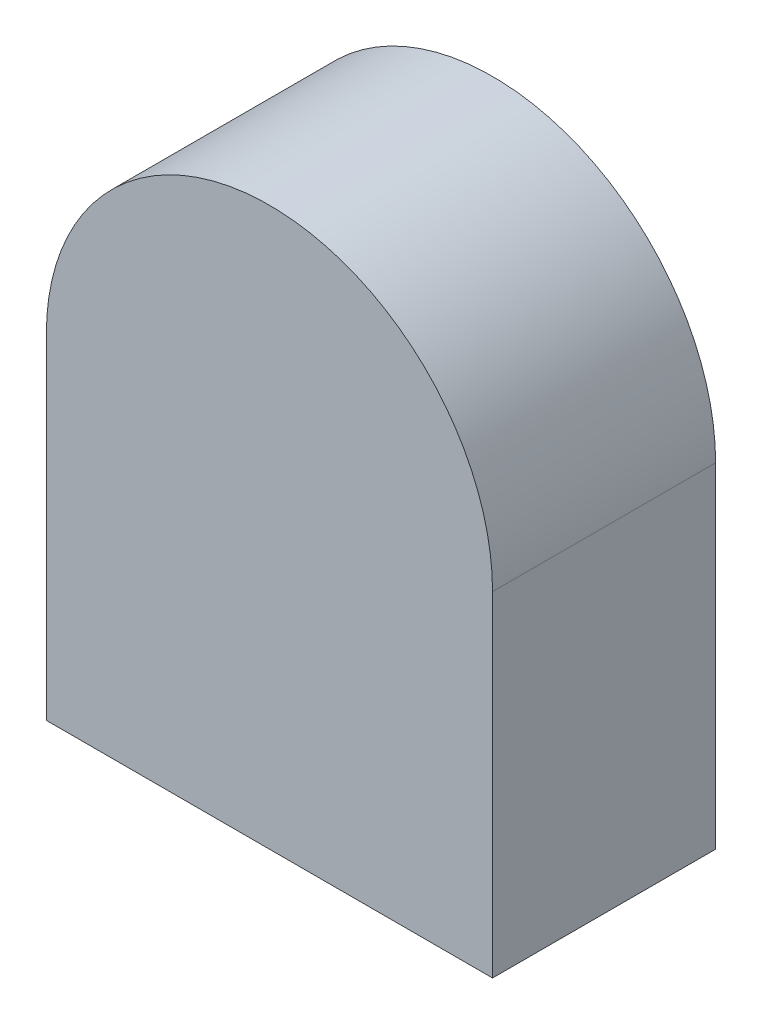
ISO-10303-21;
HEADER;
FILE_DESCRIPTION(('STEP AP214'),'2;1');
FILE_NAME('part.step','',(''),(''),'','','');
FILE_SCHEMA(('AUTOMOTIVE_DESIGN { 1 0 10303 214 1 1 1 1 }'));
ENDSEC;
DATA;
#1=APPLICATION_CONTEXT('core data for automotive mechanical design processes');
#2=APPLICATION_PROTOCOL_DEFINITION('international standard','automotive_design',2000,#1);
#3=PRODUCT_CONTEXT('',#1,'mechanical');
#4=PRODUCT('Part','Part','',(#3));
#5=PRODUCT_RELATED_PRODUCT_CATEGORY('part','',(#4));
#6=PRODUCT_DEFINITION_FORMATION('','',#4);
#7=PRODUCT_DEFINITION_CONTEXT('part definition',#1,'design');
#8=PRODUCT_DEFINITION('design','',#6,#7);
#9=PRODUCT_DEFINITION_SHAPE('','',#8);
#10=(LENGTH_UNIT() NAMED_UNIT(*) SI_UNIT(.MILLI.,.METRE.));
#11=(NAMED_UNIT(*) PLANE_ANGLE_UNIT() SI_UNIT($,.RADIAN.));
#12=(NAMED_UNIT(*) SI_UNIT($,.STERADIAN.) SOLID_ANGLE_UNIT());
#13=UNCERTAINTY_MEASURE_WITH_UNIT(LENGTH_MEASURE(1.E-05),#10,'distance_accuracy_value','');
#14=(GEOMETRIC_REPRESENTATION_CONTEXT(3) GLOBAL_UNCERTAINTY_ASSIGNED_CONTEXT((#13)) GLOBAL_UNIT_ASSIGNED_CONTEXT((#10,
#11,#12)) REPRESENTATION_CONTEXT('',''));
#15=CARTESIAN_POINT('',(0.,0.,0.));
#16=DIRECTION('',(0.,0.,1.));
#17=DIRECTION('',(1.,0.,0.));
#18=AXIS2_PLACEMENT_3D('',#15,#16,#17);
#19=CARTESIAN_POINT('',(922.018308264,100.,20.));
#20=DIRECTION('',(1.,0.,0.));
#21=DIRECTION('',(0.,0.,-1.));
#22=AXIS2_PLACEMENT_3D('',#19,#20,#21);
#23=PLANE('',#22);
#24=DIRECTION('',(0.,0.,1.));
#25=VECTOR('',#24,1.);
#26=CARTESIAN_POINT('',(922.018308264,100.,10.));
#27=LINE('',#26,#25);
#28=CARTESIAN_POINT('',(922.018308264,100.,0.));
#29=VERTEX_POINT('',#28);
#30=CARTESIAN_POINT('',(922.018308264,100.,20.));
#31=VERTEX_POINT('',#30);
#32=EDGE_CURVE('E76',#29,#31,#27,.T.);
#33=ORIENTED_EDGE('',*,*,#32,.T.);
#34=DIRECTION('',(0.,-1.,0.));
#35=VECTOR('',#34,1.);
#36=CARTESIAN_POINT('',(922.018308264,125.15,20.));
#37=LINE('',#36,#35);
#38=CARTESIAN_POINT('',(922.018308264,130.,20.));
#39=VERTEX_POINT('',#38);
#40=EDGE_CURVE('E54',#39,#31,#37,.T.);
#41=ORIENTED_EDGE('',*,*,#40,.F.);
#42=DIRECTION('',(0.,0.,1.));
#43=VECTOR('',#42,1.);
#44=CARTESIAN_POINT('',(922.018308264,130.,10.));
#45=LINE('',#44,#43);
#46=CARTESIAN_POINT('',(922.018308264,130.,0.));
#47=VERTEX_POINT('',#46);
#48=EDGE_CURVE('E48',#39,#47,#45,.F.);
#49=ORIENTED_EDGE('',*,*,#48,.T.);
#50=DIRECTION('',(0.,-1.,0.));
#51=VECTOR('',#50,1.);
#52=CARTESIAN_POINT('',(922.018308264,125.15,0.));
#53=LINE('',#52,#51);
#54=EDGE_CURVE('E77',#47,#29,#53,.T.);
#55=ORIENTED_EDGE('',*,*,#54,.T.);
#56=EDGE_LOOP('',(#33,#41,#49,#55));
#57=FACE_BOUND('',#56,.T.);
#58=ADVANCED_FACE('F16',(#57),#23,.F.);
#59=CARTESIAN_POINT('',(922.018308264,100.,0.));
#60=DIRECTION('',(0.,1.,0.));
#61=DIRECTION('',(0.,0.,1.));
#62=AXIS2_PLACEMENT_3D('',#59,#60,#61);
#63=PLANE('',#62);
#64=DIRECTION('',(0.,0.,1.));
#65=VECTOR('',#64,1.);
#66=CARTESIAN_POINT('',(962.018308264,100.,10.));
#67=LINE('',#66,#65);
#68=CARTESIAN_POINT('',(962.018308264,100.,0.));
#69=VERTEX_POINT('',#68);
#70=CARTESIAN_POINT('',(962.018308264,100.,20.));
#71=VERTEX_POINT('',#70);
#72=EDGE_CURVE('E64',#69,#71,#67,.T.);
#73=ORIENTED_EDGE('',*,*,#72,.T.);
#74=DIRECTION('',(1.,0.,0.));
#75=VECTOR('',#74,1.);
#76=CARTESIAN_POINT('',(942.018308264,100.,20.));
#77=LINE('',#76,#75);
#78=EDGE_CURVE('E99',#31,#71,#77,.T.);
#79=ORIENTED_EDGE('',*,*,#78,.F.);
#80=ORIENTED_EDGE('',*,*,#32,.F.);
#81=DIRECTION('',(1.,0.,0.));
#82=VECTOR('',#81,1.);
#83=CARTESIAN_POINT('',(942.018308264,100.,0.));
#84=LINE('',#83,#82);
#85=EDGE_CURVE('E72',#29,#69,#84,.T.);
#86=ORIENTED_EDGE('',*,*,#85,.T.);
#87=EDGE_LOOP('',(#73,#79,#80,#86));
#88=FACE_BOUND('',#87,.T.);
#89=ADVANCED_FACE('F75',(#88),#63,.F.);
#90=CARTESIAN_POINT('',(922.018308264,100.,20.));
#91=DIRECTION('',(0.,0.,1.));
#92=DIRECTION('',(1.,0.,0.));
#93=AXIS2_PLACEMENT_3D('',#90,#91,#92);
#94=PLANE('',#93);
#95=ORIENTED_EDGE('',*,*,#40,.T.);
#96=ORIENTED_EDGE('',*,*,#78,.T.);
#97=DIRECTION('',(0.,1.,0.));
#98=VECTOR('',#97,1.);
#99=CARTESIAN_POINT('',(962.018308264,115.,20.));
#100=LINE('',#99,#98);
#101=CARTESIAN_POINT('',(962.018308264,130.,20.));
#102=VERTEX_POINT('',#101);
#103=EDGE_CURVE('E69',#71,#102,#100,.T.);
#104=ORIENTED_EDGE('',*,*,#103,.T.);
#105=CARTESIAN_POINT('',(942.018308264,130.,20.));
#106=DIRECTION('',(0.,0.,-1.));
#107=DIRECTION('',(0.,1.,0.));
#108=AXIS2_PLACEMENT_3D('',#105,#106,#107);
#109=CIRCLE('',#108,20.);
#110=EDGE_CURVE('E20',#102,#39,#109,.F.);
#111=ORIENTED_EDGE('',*,*,#110,.T.);
#112=EDGE_LOOP('',(#95,#96,#104,#111));
#113=FACE_BOUND('',#112,.T.);
#114=ADVANCED_FACE('F87',(#113),#94,.T.);
#115=CARTESIAN_POINT('',(942.018308264,130.,20.));
#116=DIRECTION('',(0.,0.,-1.));
#117=DIRECTION('',(0.,1.,0.));
#118=AXIS2_PLACEMENT_3D('',#115,#116,#117);
#119=CYLINDRICAL_SURFACE('',#118,20.);
#120=ORIENTED_EDGE('',*,*,#48,.F.);
#121=ORIENTED_EDGE('',*,*,#110,.F.);
#122=DIRECTION('',(0.,0.,-1.));
#123=VECTOR('',#122,1.);
#124=CARTESIAN_POINT('',(962.018308264,130.,10.));
#125=LINE('',#124,#123);
#126=CARTESIAN_POINT('',(962.018308264,130.,0.));
#127=VERTEX_POINT('',#126);
#128=EDGE_CURVE('E26',#102,#127,#125,.T.);
#129=ORIENTED_EDGE('',*,*,#128,.T.);
#130=CARTESIAN_POINT('',(942.018308264,130.,0.));
#131=DIRECTION('',(0.,0.,-1.));
#132=DIRECTION('',(0.,1.,0.));
#133=AXIS2_PLACEMENT_3D('',#130,#131,#132);
#134=CIRCLE('',#133,20.);
#135=EDGE_CURVE('E34',#127,#47,#134,.F.);
#136=ORIENTED_EDGE('',*,*,#135,.T.);
#137=EDGE_LOOP('',(#120,#121,#129,#136));
#138=FACE_BOUND('',#137,.T.);
#139=ADVANCED_FACE('F81',(#138),#119,.T.);
#140=CARTESIAN_POINT('',(922.018308264,100.,0.));
#141=DIRECTION('',(0.,0.,1.));
#142=DIRECTION('',(1.,0.,0.));
#143=AXIS2_PLACEMENT_3D('',#140,#141,#142);
#144=PLANE('',#143);
#145=ORIENTED_EDGE('',*,*,#85,.F.);
#146=ORIENTED_EDGE('',*,*,#54,.F.);
#147=ORIENTED_EDGE('',*,*,#135,.F.);
#148=DIRECTION('',(0.,-1.,0.));
#149=VECTOR('',#148,1.);
#150=CARTESIAN_POINT('',(962.018308264,115.,0.));
#151=LINE('',#150,#149);
#152=EDGE_CURVE('E10',#127,#69,#151,.T.);
#153=ORIENTED_EDGE('',*,*,#152,.T.);
#154=EDGE_LOOP('',(#145,#146,#147,#153));
#155=FACE_BOUND('',#154,.T.);
#156=ADVANCED_FACE('F79',(#155),#144,.F.);
#157=CARTESIAN_POINT('',(962.018308264,100.,0.));
#158=DIRECTION('',(-1.,0.,0.));
#159=DIRECTION('',(0.,0.,1.));
#160=AXIS2_PLACEMENT_3D('',#157,#158,#159);
#161=PLANE('',#160);
#162=ORIENTED_EDGE('',*,*,#128,.F.);
#163=ORIENTED_EDGE('',*,*,#103,.F.);
#164=ORIENTED_EDGE('',*,*,#72,.F.);
#165=ORIENTED_EDGE('',*,*,#152,.F.);
#166=EDGE_LOOP('',(#162,#163,#164,#165));
#167=FACE_BOUND('',#166,.T.);
#168=ADVANCED_FACE('F18',(#167),#161,.F.);
#169=CLOSED_SHELL('',(#58,#89,#114,#139,#156,#168));
#170=MANIFOLD_SOLID_BREP('B1',#169);
#171=ADVANCED_BREP_SHAPE_REPRESENTATION('',(#18,#170),#14);
#172=SHAPE_DEFINITION_REPRESENTATION(#9,#171);
ENDSEC;
END-ISO-10303-21;
